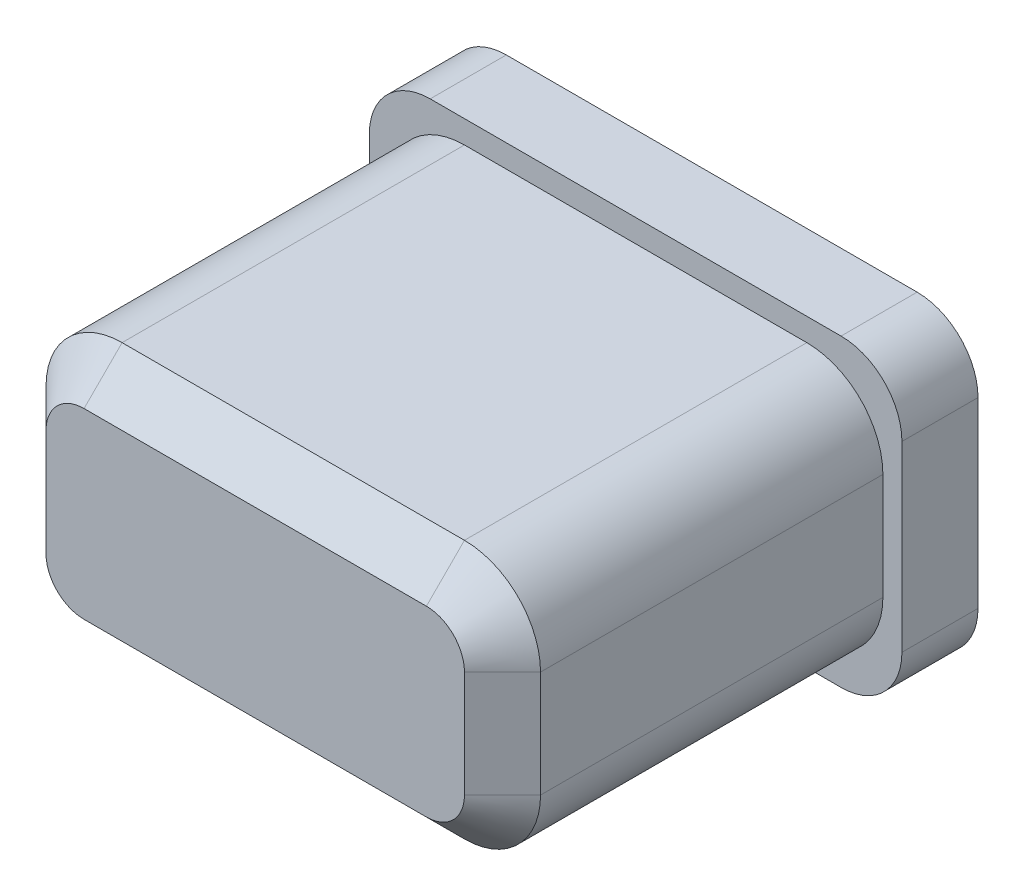
ISO-10303-21;
HEADER;
FILE_DESCRIPTION(('STEP AP214'),'2;1');
FILE_NAME('part.step','',(''),(''),'','','');
FILE_SCHEMA(('AUTOMOTIVE_DESIGN { 1 0 10303 214 1 1 1 1 }'));
ENDSEC;
DATA;
#1=APPLICATION_CONTEXT('core data for automotive mechanical design processes');
#2=APPLICATION_PROTOCOL_DEFINITION('international standard','automotive_design',2000,#1);
#3=PRODUCT_CONTEXT('',#1,'mechanical');
#4=PRODUCT('Part','Part','',(#3));
#5=PRODUCT_RELATED_PRODUCT_CATEGORY('part','',(#4));
#6=PRODUCT_DEFINITION_FORMATION('','',#4);
#7=PRODUCT_DEFINITION_CONTEXT('part definition',#1,'design');
#8=PRODUCT_DEFINITION('design','',#6,#7);
#9=PRODUCT_DEFINITION_SHAPE('','',#8);
#10=(LENGTH_UNIT() NAMED_UNIT(*) SI_UNIT(.MILLI.,.METRE.));
#11=(NAMED_UNIT(*) PLANE_ANGLE_UNIT() SI_UNIT($,.RADIAN.));
#12=(NAMED_UNIT(*) SI_UNIT($,.STERADIAN.) SOLID_ANGLE_UNIT());
#13=UNCERTAINTY_MEASURE_WITH_UNIT(LENGTH_MEASURE(1.E-05),#10,'distance_accuracy_value','');
#14=(GEOMETRIC_REPRESENTATION_CONTEXT(3) GLOBAL_UNCERTAINTY_ASSIGNED_CONTEXT((#13)) GLOBAL_UNIT_ASSIGNED_CONTEXT((#10,
#11,#12)) REPRESENTATION_CONTEXT('',''));
#15=CARTESIAN_POINT('',(0.,0.,0.));
#16=DIRECTION('',(0.,0.,1.));
#17=DIRECTION('',(1.,0.,0.));
#18=AXIS2_PLACEMENT_3D('',#15,#16,#17);
#19=CARTESIAN_POINT('',(3.25,1.7,5.));
#20=DIRECTION('',(-1.,0.,0.));
#21=DIRECTION('',(0.,0.,1.));
#22=AXIS2_PLACEMENT_3D('',#19,#20,#21);
#23=PLANE('',#22);
#24=DIRECTION('',(0.,0.,-1.));
#25=VECTOR('',#24,1.);
#26=CARTESIAN_POINT('',(3.25,0.7,5.));
#27=LINE('',#26,#25);
#28=CARTESIAN_POINT('',(3.25,0.7,0.));
#29=VERTEX_POINT('',#28);
#30=CARTESIAN_POINT('',(3.25,0.7,4.5));
#31=VERTEX_POINT('',#30);
#32=EDGE_CURVE('E232',#29,#31,#27,.F.);
#33=ORIENTED_EDGE('',*,*,#32,.T.);
#34=DIRECTION('',(0.,-1.,0.));
#35=VECTOR('',#34,1.);
#36=CARTESIAN_POINT('',(3.25,-0.7,4.5));
#37=LINE('',#36,#35);
#38=CARTESIAN_POINT('',(3.25,-0.7,4.5));
#39=VERTEX_POINT('',#38);
#40=EDGE_CURVE('E272',#31,#39,#37,.T.);
#41=ORIENTED_EDGE('',*,*,#40,.T.);
#42=DIRECTION('',(0.,0.,-1.));
#43=VECTOR('',#42,1.);
#44=CARTESIAN_POINT('',(3.25,-0.7,5.));
#45=LINE('',#44,#43);
#46=CARTESIAN_POINT('',(3.25,-0.7,0.));
#47=VERTEX_POINT('',#46);
#48=EDGE_CURVE('E229',#39,#47,#45,.T.);
#49=ORIENTED_EDGE('',*,*,#48,.T.);
#50=DIRECTION('',(0.,1.,0.));
#51=VECTOR('',#50,1.);
#52=CARTESIAN_POINT('',(3.25,1.7,0.));
#53=LINE('',#52,#51);
#54=EDGE_CURVE('E324',#47,#29,#53,.T.);
#55=ORIENTED_EDGE('',*,*,#54,.T.);
#56=EDGE_LOOP('',(#33,#41,#49,#55));
#57=FACE_BOUND('',#56,.T.);
#58=ADVANCED_FACE('F41',(#57),#23,.F.);
#59=CARTESIAN_POINT('',(-3.25,1.7,5.));
#60=DIRECTION('',(0.,-1.,0.));
#61=DIRECTION('',(0.,0.,-1.));
#62=AXIS2_PLACEMENT_3D('',#59,#60,#61);
#63=PLANE('',#62);
#64=DIRECTION('',(0.,0.,-1.));
#65=VECTOR('',#64,1.);
#66=CARTESIAN_POINT('',(-2.25,1.7,5.));
#67=LINE('',#66,#65);
#68=CARTESIAN_POINT('',(-2.25,1.7,0.));
#69=VERTEX_POINT('',#68);
#70=CARTESIAN_POINT('',(-2.25,1.7,4.5));
#71=VERTEX_POINT('',#70);
#72=EDGE_CURVE('E225',#69,#71,#67,.F.);
#73=ORIENTED_EDGE('',*,*,#72,.T.);
#74=DIRECTION('',(1.,0.,0.));
#75=VECTOR('',#74,1.);
#76=CARTESIAN_POINT('',(2.25,1.7,4.5));
#77=LINE('',#76,#75);
#78=CARTESIAN_POINT('',(2.25,1.7,4.5));
#79=VERTEX_POINT('',#78);
#80=EDGE_CURVE('E289',#71,#79,#77,.T.);
#81=ORIENTED_EDGE('',*,*,#80,.T.);
#82=DIRECTION('',(0.,0.,-1.));
#83=VECTOR('',#82,1.);
#84=CARTESIAN_POINT('',(2.25,1.7,5.));
#85=LINE('',#84,#83);
#86=CARTESIAN_POINT('',(2.25,1.7,0.));
#87=VERTEX_POINT('',#86);
#88=EDGE_CURVE('E222',#79,#87,#85,.T.);
#89=ORIENTED_EDGE('',*,*,#88,.T.);
#90=DIRECTION('',(-1.,0.,0.));
#91=VECTOR('',#90,1.);
#92=CARTESIAN_POINT('',(-3.25,1.7,0.));
#93=LINE('',#92,#91);
#94=EDGE_CURVE('E203',#87,#69,#93,.T.);
#95=ORIENTED_EDGE('',*,*,#94,.T.);
#96=EDGE_LOOP('',(#73,#81,#89,#95));
#97=FACE_BOUND('',#96,.T.);
#98=ADVANCED_FACE('F460',(#97),#63,.F.);
#99=CARTESIAN_POINT('',(-3.25,1.7,5.));
#100=DIRECTION('',(1.,0.,0.));
#101=DIRECTION('',(0.,1.,0.));
#102=AXIS2_PLACEMENT_3D('',#99,#100,#101);
#103=PLANE('',#102);
#104=DIRECTION('',(0.,0.,-1.));
#105=VECTOR('',#104,1.);
#106=CARTESIAN_POINT('',(-3.25,-0.7,5.));
#107=LINE('',#106,#105);
#108=CARTESIAN_POINT('',(-3.25,-0.7,0.));
#109=VERTEX_POINT('',#108);
#110=CARTESIAN_POINT('',(-3.25,-0.7,4.5));
#111=VERTEX_POINT('',#110);
#112=EDGE_CURVE('E180',#109,#111,#107,.F.);
#113=ORIENTED_EDGE('',*,*,#112,.T.);
#114=DIRECTION('',(0.,1.,0.));
#115=VECTOR('',#114,1.);
#116=CARTESIAN_POINT('',(-3.25,0.7,4.5));
#117=LINE('',#116,#115);
#118=CARTESIAN_POINT('',(-3.25,0.7,4.5));
#119=VERTEX_POINT('',#118);
#120=EDGE_CURVE('E283',#111,#119,#117,.T.);
#121=ORIENTED_EDGE('',*,*,#120,.T.);
#122=DIRECTION('',(0.,0.,-1.));
#123=VECTOR('',#122,1.);
#124=CARTESIAN_POINT('',(-3.25,0.7,5.));
#125=LINE('',#124,#123);
#126=CARTESIAN_POINT('',(-3.25,0.7,0.));
#127=VERTEX_POINT('',#126);
#128=EDGE_CURVE('E192',#119,#127,#125,.T.);
#129=ORIENTED_EDGE('',*,*,#128,.T.);
#130=DIRECTION('',(0.,-1.,0.));
#131=VECTOR('',#130,1.);
#132=CARTESIAN_POINT('',(-3.25,1.7,0.));
#133=LINE('',#132,#131);
#134=EDGE_CURVE('E196',#127,#109,#133,.T.);
#135=ORIENTED_EDGE('',*,*,#134,.T.);
#136=EDGE_LOOP('',(#113,#121,#129,#135));
#137=FACE_BOUND('',#136,.T.);
#138=ADVANCED_FACE('F197',(#137),#103,.F.);
#139=CARTESIAN_POINT('',(-3.25,-1.7,5.));
#140=DIRECTION('',(0.,1.,0.));
#141=DIRECTION('',(0.,0.,1.));
#142=AXIS2_PLACEMENT_3D('',#139,#140,#141);
#143=PLANE('',#142);
#144=DIRECTION('',(0.,0.,-1.));
#145=VECTOR('',#144,1.);
#146=CARTESIAN_POINT('',(2.25,-1.7,5.));
#147=LINE('',#146,#145);
#148=CARTESIAN_POINT('',(2.25,-1.7,0.));
#149=VERTEX_POINT('',#148);
#150=CARTESIAN_POINT('',(2.25,-1.7,4.5));
#151=VERTEX_POINT('',#150);
#152=EDGE_CURVE('E239',#149,#151,#147,.F.);
#153=ORIENTED_EDGE('',*,*,#152,.T.);
#154=DIRECTION('',(-1.,0.,0.));
#155=VECTOR('',#154,1.);
#156=CARTESIAN_POINT('',(-2.25,-1.7,4.5));
#157=LINE('',#156,#155);
#158=CARTESIAN_POINT('',(-2.25,-1.7,4.5));
#159=VERTEX_POINT('',#158);
#160=EDGE_CURVE('E278',#151,#159,#157,.T.);
#161=ORIENTED_EDGE('',*,*,#160,.T.);
#162=DIRECTION('',(0.,0.,-1.));
#163=VECTOR('',#162,1.);
#164=CARTESIAN_POINT('',(-2.25,-1.7,5.));
#165=LINE('',#164,#163);
#166=CARTESIAN_POINT('',(-2.25,-1.7,0.));
#167=VERTEX_POINT('',#166);
#168=EDGE_CURVE('E236',#159,#167,#165,.T.);
#169=ORIENTED_EDGE('',*,*,#168,.T.);
#170=DIRECTION('',(1.,0.,0.));
#171=VECTOR('',#170,1.);
#172=CARTESIAN_POINT('',(-3.25,-1.7,0.));
#173=LINE('',#172,#171);
#174=EDGE_CURVE('E193',#167,#149,#173,.T.);
#175=ORIENTED_EDGE('',*,*,#174,.T.);
#176=EDGE_LOOP('',(#153,#161,#169,#175));
#177=FACE_BOUND('',#176,.T.);
#178=ADVANCED_FACE('F405',(#177),#143,.F.);
#179=CARTESIAN_POINT('',(0.,0.,5.));
#180=DIRECTION('',(0.,0.,1.));
#181=DIRECTION('',(1.,0.,0.));
#182=AXIS2_PLACEMENT_3D('',#179,#180,#181);
#183=PLANE('',#182);
#184=DIRECTION('',(0.,1.,0.));
#185=VECTOR('',#184,1.);
#186=CARTESIAN_POINT('',(2.75,0.7,5.));
#187=LINE('',#186,#185);
#188=CARTESIAN_POINT('',(2.75,-0.7,5.));
#189=VERTEX_POINT('',#188);
#190=CARTESIAN_POINT('',(2.75,0.7,5.));
#191=VERTEX_POINT('',#190);
#192=EDGE_CURVE('E261',#189,#191,#187,.T.);
#193=ORIENTED_EDGE('',*,*,#192,.T.);
#194=CARTESIAN_POINT('',(2.25,0.7,5.));
#195=DIRECTION('',(0.,0.,1.));
#196=DIRECTION('',(1.,0.,0.));
#197=AXIS2_PLACEMENT_3D('',#194,#195,#196);
#198=CIRCLE('',#197,0.5);
#199=CARTESIAN_POINT('',(2.25,1.2,5.));
#200=VERTEX_POINT('',#199);
#201=EDGE_CURVE('E264',#191,#200,#198,.T.);
#202=ORIENTED_EDGE('',*,*,#201,.T.);
#203=DIRECTION('',(-1.,0.,0.));
#204=VECTOR('',#203,1.);
#205=CARTESIAN_POINT('',(-2.25,1.2,5.));
#206=LINE('',#205,#204);
#207=CARTESIAN_POINT('',(-2.25,1.2,5.));
#208=VERTEX_POINT('',#207);
#209=EDGE_CURVE('E243',#200,#208,#206,.T.);
#210=ORIENTED_EDGE('',*,*,#209,.T.);
#211=CARTESIAN_POINT('',(-2.25,0.7,5.));
#212=DIRECTION('',(0.,0.,1.));
#213=DIRECTION('',(1.,0.,0.));
#214=AXIS2_PLACEMENT_3D('',#211,#212,#213);
#215=CIRCLE('',#214,0.5);
#216=CARTESIAN_POINT('',(-2.75,0.7,5.));
#217=VERTEX_POINT('',#216);
#218=EDGE_CURVE('E246',#208,#217,#215,.T.);
#219=ORIENTED_EDGE('',*,*,#218,.T.);
#220=DIRECTION('',(0.,-1.,0.));
#221=VECTOR('',#220,1.);
#222=CARTESIAN_POINT('',(-2.75,-0.7,5.));
#223=LINE('',#222,#221);
#224=CARTESIAN_POINT('',(-2.75,-0.7,5.));
#225=VERTEX_POINT('',#224);
#226=EDGE_CURVE('E249',#217,#225,#223,.T.);
#227=ORIENTED_EDGE('',*,*,#226,.T.);
#228=CARTESIAN_POINT('',(-2.25,-0.7,5.));
#229=DIRECTION('',(0.,0.,1.));
#230=DIRECTION('',(1.,0.,0.));
#231=AXIS2_PLACEMENT_3D('',#228,#229,#230);
#232=CIRCLE('',#231,0.5);
#233=CARTESIAN_POINT('',(-2.25,-1.2,5.));
#234=VERTEX_POINT('',#233);
#235=EDGE_CURVE('E252',#225,#234,#232,.T.);
#236=ORIENTED_EDGE('',*,*,#235,.T.);
#237=DIRECTION('',(1.,0.,0.));
#238=VECTOR('',#237,1.);
#239=CARTESIAN_POINT('',(2.25,-1.2,5.));
#240=LINE('',#239,#238);
#241=CARTESIAN_POINT('',(2.25,-1.2,5.));
#242=VERTEX_POINT('',#241);
#243=EDGE_CURVE('E255',#234,#242,#240,.T.);
#244=ORIENTED_EDGE('',*,*,#243,.T.);
#245=CARTESIAN_POINT('',(2.25,-0.7,5.));
#246=DIRECTION('',(0.,0.,1.));
#247=DIRECTION('',(1.,0.,0.));
#248=AXIS2_PLACEMENT_3D('',#245,#246,#247);
#249=CIRCLE('',#248,0.5);
#250=EDGE_CURVE('E258',#242,#189,#249,.T.);
#251=ORIENTED_EDGE('',*,*,#250,.T.);
#252=EDGE_LOOP('',(#193,#202,#210,#219,#227,#236,#244,#251));
#253=FACE_BOUND('',#252,.T.);
#254=ADVANCED_FACE('F434',(#253),#183,.T.);
#255=CARTESIAN_POINT('',(-2.25,0.7,5.));
#256=DIRECTION('',(0.,0.,-1.));
#257=DIRECTION('',(-1.,0.,0.));
#258=AXIS2_PLACEMENT_3D('',#255,#256,#257);
#259=CYLINDRICAL_SURFACE('',#258,1.);
#260=ORIENTED_EDGE('',*,*,#128,.F.);
#261=CARTESIAN_POINT('',(-2.25,0.7,4.5));
#262=DIRECTION('',(0.,0.,1.));
#263=DIRECTION('',(1.,0.,0.));
#264=AXIS2_PLACEMENT_3D('',#261,#262,#263);
#265=CIRCLE('',#264,1.);
#266=EDGE_CURVE('E286',#119,#71,#265,.F.);
#267=ORIENTED_EDGE('',*,*,#266,.T.);
#268=ORIENTED_EDGE('',*,*,#72,.F.);
#269=CARTESIAN_POINT('',(-2.25,0.7,0.));
#270=DIRECTION('',(0.,0.,1.));
#271=DIRECTION('',(1.,0.,0.));
#272=AXIS2_PLACEMENT_3D('',#269,#270,#271);
#273=CIRCLE('',#272,1.);
#274=EDGE_CURVE('E219',#127,#69,#273,.F.);
#275=ORIENTED_EDGE('',*,*,#274,.F.);
#276=EDGE_LOOP('',(#260,#267,#268,#275));
#277=FACE_BOUND('',#276,.T.);
#278=ADVANCED_FACE('F457',(#277),#259,.T.);
#279=CARTESIAN_POINT('',(2.25,0.7,5.));
#280=DIRECTION('',(0.,0.,-1.));
#281=DIRECTION('',(-1.,0.,0.));
#282=AXIS2_PLACEMENT_3D('',#279,#280,#281);
#283=CYLINDRICAL_SURFACE('',#282,1.);
#284=ORIENTED_EDGE('',*,*,#88,.F.);
#285=CARTESIAN_POINT('',(2.25,0.7,4.5));
#286=DIRECTION('',(0.,0.,1.));
#287=DIRECTION('',(1.,0.,0.));
#288=AXIS2_PLACEMENT_3D('',#285,#286,#287);
#289=CIRCLE('',#288,1.);
#290=EDGE_CURVE('E268',#79,#31,#289,.F.);
#291=ORIENTED_EDGE('',*,*,#290,.T.);
#292=ORIENTED_EDGE('',*,*,#32,.F.);
#293=CARTESIAN_POINT('',(2.25,0.7,0.));
#294=DIRECTION('',(0.,0.,1.));
#295=DIRECTION('',(1.,0.,0.));
#296=AXIS2_PLACEMENT_3D('',#293,#294,#295);
#297=CIRCLE('',#296,1.);
#298=EDGE_CURVE('E212',#87,#29,#297,.F.);
#299=ORIENTED_EDGE('',*,*,#298,.F.);
#300=EDGE_LOOP('',(#284,#291,#292,#299));
#301=FACE_BOUND('',#300,.T.);
#302=ADVANCED_FACE('F419',(#301),#283,.T.);
#303=CARTESIAN_POINT('',(2.25,-0.7,5.));
#304=DIRECTION('',(0.,0.,-1.));
#305=DIRECTION('',(-1.,0.,0.));
#306=AXIS2_PLACEMENT_3D('',#303,#304,#305);
#307=CYLINDRICAL_SURFACE('',#306,1.);
#308=ORIENTED_EDGE('',*,*,#48,.F.);
#309=CARTESIAN_POINT('',(2.25,-0.7,4.5));
#310=DIRECTION('',(0.,0.,1.));
#311=DIRECTION('',(1.,0.,0.));
#312=AXIS2_PLACEMENT_3D('',#309,#310,#311);
#313=CIRCLE('',#312,1.);
#314=EDGE_CURVE('E275',#39,#151,#313,.F.);
#315=ORIENTED_EDGE('',*,*,#314,.T.);
#316=ORIENTED_EDGE('',*,*,#152,.F.);
#317=CARTESIAN_POINT('',(2.25,-0.7,0.));
#318=DIRECTION('',(0.,0.,1.));
#319=DIRECTION('',(1.,0.,0.));
#320=AXIS2_PLACEMENT_3D('',#317,#318,#319);
#321=CIRCLE('',#320,1.);
#322=EDGE_CURVE('E208',#47,#149,#321,.F.);
#323=ORIENTED_EDGE('',*,*,#322,.F.);
#324=EDGE_LOOP('',(#308,#315,#316,#323));
#325=FACE_BOUND('',#324,.T.);
#326=ADVANCED_FACE('F410',(#325),#307,.T.);
#327=CARTESIAN_POINT('',(-2.25,-0.7,5.));
#328=DIRECTION('',(0.,0.,-1.));
#329=DIRECTION('',(-1.,0.,0.));
#330=AXIS2_PLACEMENT_3D('',#327,#328,#329);
#331=CYLINDRICAL_SURFACE('',#330,1.);
#332=ORIENTED_EDGE('',*,*,#168,.F.);
#333=CARTESIAN_POINT('',(-2.25,-0.7,4.5));
#334=DIRECTION('',(0.,0.,1.));
#335=DIRECTION('',(1.,0.,0.));
#336=AXIS2_PLACEMENT_3D('',#333,#334,#335);
#337=CIRCLE('',#336,1.);
#338=EDGE_CURVE('E188',#159,#111,#337,.F.);
#339=ORIENTED_EDGE('',*,*,#338,.T.);
#340=ORIENTED_EDGE('',*,*,#112,.F.);
#341=CARTESIAN_POINT('',(-2.25,-0.7,0.));
#342=DIRECTION('',(0.,0.,1.));
#343=DIRECTION('',(1.,0.,0.));
#344=AXIS2_PLACEMENT_3D('',#341,#342,#343);
#345=CIRCLE('',#344,1.);
#346=EDGE_CURVE('E185',#167,#109,#345,.F.);
#347=ORIENTED_EDGE('',*,*,#346,.F.);
#348=EDGE_LOOP('',(#332,#339,#340,#347));
#349=FACE_BOUND('',#348,.T.);
#350=ADVANCED_FACE('F183',(#349),#331,.T.);
#351=CARTESIAN_POINT('',(-2.25,-0.7,5.));
#352=DIRECTION('',(0.,0.,-1.));
#353=DIRECTION('',(-1.,0.,0.));
#354=AXIS2_PLACEMENT_3D('',#351,#352,#353);
#355=CONICAL_SURFACE('',#354,0.5,0.785398163397447);
#356=DIRECTION('',(0.707106781186546,0.,0.707106781186549));
#357=VECTOR('',#356,1.);
#358=CARTESIAN_POINT('',(-3.25,-0.7,4.5));
#359=LINE('',#358,#357);
#360=EDGE_CURVE('E316',#111,#225,#359,.T.);
#361=ORIENTED_EDGE('',*,*,#360,.F.);
#362=ORIENTED_EDGE('',*,*,#338,.F.);
#363=DIRECTION('',(0.,-0.707106781186546,-0.707106781186549));
#364=VECTOR('',#363,1.);
#365=CARTESIAN_POINT('',(-2.25,-1.2,5.));
#366=LINE('',#365,#364);
#367=EDGE_CURVE('E320',#234,#159,#366,.T.);
#368=ORIENTED_EDGE('',*,*,#367,.F.);
#369=ORIENTED_EDGE('',*,*,#235,.F.);
#370=EDGE_LOOP('',(#361,#362,#368,#369));
#371=FACE_BOUND('',#370,.T.);
#372=ADVANCED_FACE('F448',(#371),#355,.T.);
#373=CARTESIAN_POINT('',(0.,-1.2,5.));
#374=DIRECTION('',(0.,-0.707106781186549,0.707106781186546));
#375=DIRECTION('',(-1.,0.,0.));
#376=AXIS2_PLACEMENT_3D('',#373,#374,#375);
#377=PLANE('',#376);
#378=ORIENTED_EDGE('',*,*,#367,.T.);
#379=ORIENTED_EDGE('',*,*,#160,.F.);
#380=DIRECTION('',(0.,-0.707106781186546,-0.707106781186549));
#381=VECTOR('',#380,1.);
#382=CARTESIAN_POINT('',(2.25,-1.2,5.));
#383=LINE('',#382,#381);
#384=EDGE_CURVE('E312',#242,#151,#383,.T.);
#385=ORIENTED_EDGE('',*,*,#384,.F.);
#386=ORIENTED_EDGE('',*,*,#243,.F.);
#387=EDGE_LOOP('',(#378,#379,#385,#386));
#388=FACE_BOUND('',#387,.T.);
#389=ADVANCED_FACE('F445',(#388),#377,.T.);
#390=CARTESIAN_POINT('',(-2.75,0.,5.));
#391=DIRECTION('',(-0.707106781186549,0.,0.707106781186546));
#392=DIRECTION('',(0.,1.,0.));
#393=AXIS2_PLACEMENT_3D('',#390,#391,#392);
#394=PLANE('',#393);
#395=ORIENTED_EDGE('',*,*,#360,.T.);
#396=ORIENTED_EDGE('',*,*,#226,.F.);
#397=DIRECTION('',(0.707106781186547,0.,0.707106781186548));
#398=VECTOR('',#397,1.);
#399=CARTESIAN_POINT('',(-3.25,0.7,4.5));
#400=LINE('',#399,#398);
#401=EDGE_CURVE('E308',#119,#217,#400,.T.);
#402=ORIENTED_EDGE('',*,*,#401,.F.);
#403=ORIENTED_EDGE('',*,*,#120,.F.);
#404=EDGE_LOOP('',(#395,#396,#402,#403));
#405=FACE_BOUND('',#404,.T.);
#406=ADVANCED_FACE('F454',(#405),#394,.T.);
#407=CARTESIAN_POINT('',(2.25,-0.7,5.));
#408=DIRECTION('',(0.,0.,-1.));
#409=DIRECTION('',(-1.,0.,0.));
#410=AXIS2_PLACEMENT_3D('',#407,#408,#409);
#411=CONICAL_SURFACE('',#410,0.5,0.785398163397447);
#412=ORIENTED_EDGE('',*,*,#384,.T.);
#413=ORIENTED_EDGE('',*,*,#314,.F.);
#414=DIRECTION('',(0.707106781186546,0.,-0.707106781186549));
#415=VECTOR('',#414,1.);
#416=CARTESIAN_POINT('',(2.75,-0.7,5.));
#417=LINE('',#416,#415);
#418=EDGE_CURVE('E304',#189,#39,#417,.T.);
#419=ORIENTED_EDGE('',*,*,#418,.F.);
#420=ORIENTED_EDGE('',*,*,#250,.F.);
#421=EDGE_LOOP('',(#412,#413,#419,#420));
#422=FACE_BOUND('',#421,.T.);
#423=ADVANCED_FACE('F441',(#422),#411,.T.);
#424=CARTESIAN_POINT('',(-2.25,0.7,5.));
#425=DIRECTION('',(0.,0.,-1.));
#426=DIRECTION('',(-1.,0.,0.));
#427=AXIS2_PLACEMENT_3D('',#424,#425,#426);
#428=CONICAL_SURFACE('',#427,0.5,0.785398163397447);
#429=ORIENTED_EDGE('',*,*,#401,.T.);
#430=ORIENTED_EDGE('',*,*,#218,.F.);
#431=DIRECTION('',(0.,-0.707106781186546,0.707106781186549));
#432=VECTOR('',#431,1.);
#433=CARTESIAN_POINT('',(-2.25,1.7,4.5));
#434=LINE('',#433,#432);
#435=EDGE_CURVE('E300',#71,#208,#434,.T.);
#436=ORIENTED_EDGE('',*,*,#435,.F.);
#437=ORIENTED_EDGE('',*,*,#266,.F.);
#438=EDGE_LOOP('',(#429,#430,#436,#437));
#439=FACE_BOUND('',#438,.T.);
#440=ADVANCED_FACE('F462',(#439),#428,.T.);
#441=CARTESIAN_POINT('',(2.75,0.,5.));
#442=DIRECTION('',(0.707106781186549,0.,0.707106781186546));
#443=DIRECTION('',(0.,-1.,0.));
#444=AXIS2_PLACEMENT_3D('',#441,#442,#443);
#445=PLANE('',#444);
#446=ORIENTED_EDGE('',*,*,#418,.T.);
#447=ORIENTED_EDGE('',*,*,#40,.F.);
#448=DIRECTION('',(0.707106781186546,0.,-0.707106781186549));
#449=VECTOR('',#448,1.);
#450=CARTESIAN_POINT('',(2.75,0.7,5.));
#451=LINE('',#450,#449);
#452=EDGE_CURVE('E296',#191,#31,#451,.T.);
#453=ORIENTED_EDGE('',*,*,#452,.F.);
#454=ORIENTED_EDGE('',*,*,#192,.F.);
#455=EDGE_LOOP('',(#446,#447,#453,#454));
#456=FACE_BOUND('',#455,.T.);
#457=ADVANCED_FACE('F439',(#456),#445,.T.);
#458=CARTESIAN_POINT('',(0.,1.2,5.));
#459=DIRECTION('',(0.,0.707106781186549,0.707106781186546));
#460=DIRECTION('',(1.,0.,0.));
#461=AXIS2_PLACEMENT_3D('',#458,#459,#460);
#462=PLANE('',#461);
#463=ORIENTED_EDGE('',*,*,#435,.T.);
#464=ORIENTED_EDGE('',*,*,#209,.F.);
#465=DIRECTION('',(0.,-0.707106781186546,0.707106781186549));
#466=VECTOR('',#465,1.);
#467=CARTESIAN_POINT('',(2.25,1.7,4.5));
#468=LINE('',#467,#466);
#469=EDGE_CURVE('E293',#79,#200,#468,.T.);
#470=ORIENTED_EDGE('',*,*,#469,.F.);
#471=ORIENTED_EDGE('',*,*,#80,.F.);
#472=EDGE_LOOP('',(#463,#464,#470,#471));
#473=FACE_BOUND('',#472,.T.);
#474=ADVANCED_FACE('F430',(#473),#462,.T.);
#475=CARTESIAN_POINT('',(2.25,0.7,5.));
#476=DIRECTION('',(0.,0.,-1.));
#477=DIRECTION('',(-1.,0.,0.));
#478=AXIS2_PLACEMENT_3D('',#475,#476,#477);
#479=CONICAL_SURFACE('',#478,0.5,0.785398163397447);
#480=ORIENTED_EDGE('',*,*,#452,.T.);
#481=ORIENTED_EDGE('',*,*,#290,.F.);
#482=ORIENTED_EDGE('',*,*,#469,.T.);
#483=ORIENTED_EDGE('',*,*,#201,.F.);
#484=EDGE_LOOP('',(#480,#481,#482,#483));
#485=FACE_BOUND('',#484,.T.);
#486=ADVANCED_FACE('F423',(#485),#479,.T.);
#487=CARTESIAN_POINT('',(0.,0.,0.));
#488=DIRECTION('',(0.,0.,1.));
#489=DIRECTION('',(1.,0.,0.));
#490=AXIS2_PLACEMENT_3D('',#487,#488,#489);
#491=PLANE('',#490);
#492=DIRECTION('',(0.,-1.,0.));
#493=VECTOR('',#492,1.);
#494=CARTESIAN_POINT('',(3.5,2.,0.));
#495=LINE('',#494,#493);
#496=CARTESIAN_POINT('',(3.5,1.2,0.));
#497=VERTEX_POINT('',#496);
#498=CARTESIAN_POINT('',(3.5,-1.2,0.));
#499=VERTEX_POINT('',#498);
#500=EDGE_CURVE('E385',#497,#499,#495,.T.);
#501=ORIENTED_EDGE('',*,*,#500,.F.);
#502=CARTESIAN_POINT('',(2.7,1.2,0.));
#503=DIRECTION('',(0.,0.,1.));
#504=DIRECTION('',(1.,0.,0.));
#505=AXIS2_PLACEMENT_3D('',#502,#503,#504);
#506=CIRCLE('',#505,0.8);
#507=CARTESIAN_POINT('',(2.7,2.,0.));
#508=VERTEX_POINT('',#507);
#509=EDGE_CURVE('E340',#497,#508,#506,.T.);
#510=ORIENTED_EDGE('',*,*,#509,.T.);
#511=DIRECTION('',(1.,0.,0.));
#512=VECTOR('',#511,1.);
#513=CARTESIAN_POINT('',(-3.5,2.,0.));
#514=LINE('',#513,#512);
#515=CARTESIAN_POINT('',(-2.7,2.,0.));
#516=VERTEX_POINT('',#515);
#517=EDGE_CURVE('E389',#516,#508,#514,.T.);
#518=ORIENTED_EDGE('',*,*,#517,.F.);
#519=CARTESIAN_POINT('',(-2.7,1.2,0.));
#520=DIRECTION('',(0.,0.,1.));
#521=DIRECTION('',(1.,0.,0.));
#522=AXIS2_PLACEMENT_3D('',#519,#520,#521);
#523=CIRCLE('',#522,0.8);
#524=CARTESIAN_POINT('',(-3.5,1.2,0.));
#525=VERTEX_POINT('',#524);
#526=EDGE_CURVE('E331',#516,#525,#523,.T.);
#527=ORIENTED_EDGE('',*,*,#526,.T.);
#528=DIRECTION('',(0.,1.,0.));
#529=VECTOR('',#528,1.);
#530=CARTESIAN_POINT('',(-3.5,2.,0.));
#531=LINE('',#530,#529);
#532=CARTESIAN_POINT('',(-3.5,-1.2,0.));
#533=VERTEX_POINT('',#532);
#534=EDGE_CURVE('E384',#533,#525,#531,.T.);
#535=ORIENTED_EDGE('',*,*,#534,.F.);
#536=CARTESIAN_POINT('',(-2.7,-1.2,0.));
#537=DIRECTION('',(0.,0.,1.));
#538=DIRECTION('',(1.,0.,0.));
#539=AXIS2_PLACEMENT_3D('',#536,#537,#538);
#540=CIRCLE('',#539,0.8);
#541=CARTESIAN_POINT('',(-2.7,-2.,0.));
#542=VERTEX_POINT('',#541);
#543=EDGE_CURVE('E334',#533,#542,#540,.T.);
#544=ORIENTED_EDGE('',*,*,#543,.T.);
#545=DIRECTION('',(-1.,0.,0.));
#546=VECTOR('',#545,1.);
#547=CARTESIAN_POINT('',(-3.5,-2.,0.));
#548=LINE('',#547,#546);
#549=CARTESIAN_POINT('',(2.7,-2.,0.));
#550=VERTEX_POINT('',#549);
#551=EDGE_CURVE('E374',#550,#542,#548,.T.);
#552=ORIENTED_EDGE('',*,*,#551,.F.);
#553=CARTESIAN_POINT('',(2.7,-1.2,0.));
#554=DIRECTION('',(0.,0.,1.));
#555=DIRECTION('',(1.,0.,0.));
#556=AXIS2_PLACEMENT_3D('',#553,#554,#555);
#557=CIRCLE('',#556,0.8);
#558=EDGE_CURVE('E337',#550,#499,#557,.T.);
#559=ORIENTED_EDGE('',*,*,#558,.T.);
#560=EDGE_LOOP('',(#501,#510,#518,#527,#535,#544,#552,#559));
#561=FACE_BOUND('',#560,.T.);
#562=ORIENTED_EDGE('',*,*,#134,.F.);
#563=ORIENTED_EDGE('',*,*,#274,.T.);
#564=ORIENTED_EDGE('',*,*,#94,.F.);
#565=ORIENTED_EDGE('',*,*,#298,.T.);
#566=ORIENTED_EDGE('',*,*,#54,.F.);
#567=ORIENTED_EDGE('',*,*,#322,.T.);
#568=ORIENTED_EDGE('',*,*,#174,.F.);
#569=ORIENTED_EDGE('',*,*,#346,.T.);
#570=EDGE_LOOP('',(#562,#563,#564,#565,#566,#567,#568,#569));
#571=FACE_BOUND('',#570,.T.);
#572=ADVANCED_FACE('F205',(#561,#571),#491,.T.);
#573=CARTESIAN_POINT('',(3.5,2.,-1.));
#574=DIRECTION('',(-1.,0.,0.));
#575=DIRECTION('',(0.,-1.,0.));
#576=AXIS2_PLACEMENT_3D('',#573,#574,#575);
#577=PLANE('',#576);
#578=DIRECTION('',(0.,-1.,0.));
#579=VECTOR('',#578,1.);
#580=CARTESIAN_POINT('',(3.5,2.,-1.));
#581=LINE('',#580,#579);
#582=CARTESIAN_POINT('',(3.5,1.2,-1.));
#583=VERTEX_POINT('',#582);
#584=CARTESIAN_POINT('',(3.5,-1.2,-1.));
#585=VERTEX_POINT('',#584);
#586=EDGE_CURVE('E397',#583,#585,#581,.T.);
#587=ORIENTED_EDGE('',*,*,#586,.F.);
#588=DIRECTION('',(0.,0.,1.));
#589=VECTOR('',#588,1.);
#590=CARTESIAN_POINT('',(3.5,1.2,-1.));
#591=LINE('',#590,#589);
#592=EDGE_CURVE('E327',#583,#497,#591,.T.);
#593=ORIENTED_EDGE('',*,*,#592,.T.);
#594=ORIENTED_EDGE('',*,*,#500,.T.);
#595=DIRECTION('',(0.,0.,1.));
#596=VECTOR('',#595,1.);
#597=CARTESIAN_POINT('',(3.5,-1.2,-1.));
#598=LINE('',#597,#596);
#599=EDGE_CURVE('E292',#499,#585,#598,.F.);
#600=ORIENTED_EDGE('',*,*,#599,.T.);
#601=EDGE_LOOP('',(#587,#593,#594,#600));
#602=FACE_BOUND('',#601,.T.);
#603=ADVANCED_FACE('F557',(#602),#577,.F.);
#604=CARTESIAN_POINT('',(-3.5,-2.,-1.));
#605=DIRECTION('',(0.,1.,0.));
#606=DIRECTION('',(-1.,0.,0.));
#607=AXIS2_PLACEMENT_3D('',#604,#605,#606);
#608=PLANE('',#607);
#609=DIRECTION('',(-1.,0.,0.));
#610=VECTOR('',#609,1.);
#611=CARTESIAN_POINT('',(-3.5,-2.,-1.));
#612=LINE('',#611,#610);
#613=CARTESIAN_POINT('',(2.7,-2.,-1.));
#614=VERTEX_POINT('',#613);
#615=CARTESIAN_POINT('',(-2.7,-2.,-1.));
#616=VERTEX_POINT('',#615);
#617=EDGE_CURVE('E376',#614,#616,#612,.T.);
#618=ORIENTED_EDGE('',*,*,#617,.F.);
#619=DIRECTION('',(0.,0.,1.));
#620=VECTOR('',#619,1.);
#621=CARTESIAN_POINT('',(2.7,-2.,-1.));
#622=LINE('',#621,#620);
#623=EDGE_CURVE('E364',#614,#550,#622,.T.);
#624=ORIENTED_EDGE('',*,*,#623,.T.);
#625=ORIENTED_EDGE('',*,*,#551,.T.);
#626=DIRECTION('',(0.,0.,1.));
#627=VECTOR('',#626,1.);
#628=CARTESIAN_POINT('',(-2.7,-2.,-1.));
#629=LINE('',#628,#627);
#630=EDGE_CURVE('E361',#542,#616,#629,.F.);
#631=ORIENTED_EDGE('',*,*,#630,.T.);
#632=EDGE_LOOP('',(#618,#624,#625,#631));
#633=FACE_BOUND('',#632,.T.);
#634=ADVANCED_FACE('F373',(#633),#608,.F.);
#635=CARTESIAN_POINT('',(-3.5,2.,-1.));
#636=DIRECTION('',(1.,0.,0.));
#637=DIRECTION('',(0.,1.,0.));
#638=AXIS2_PLACEMENT_3D('',#635,#636,#637);
#639=PLANE('',#638);
#640=DIRECTION('',(0.,1.,0.));
#641=VECTOR('',#640,1.);
#642=CARTESIAN_POINT('',(-3.5,2.,-1.));
#643=LINE('',#642,#641);
#644=CARTESIAN_POINT('',(-3.5,-1.2,-1.));
#645=VERTEX_POINT('',#644);
#646=CARTESIAN_POINT('',(-3.5,1.2,-1.));
#647=VERTEX_POINT('',#646);
#648=EDGE_CURVE('E535',#645,#647,#643,.T.);
#649=ORIENTED_EDGE('',*,*,#648,.F.);
#650=DIRECTION('',(0.,0.,1.));
#651=VECTOR('',#650,1.);
#652=CARTESIAN_POINT('',(-3.5,-1.2,-1.));
#653=LINE('',#652,#651);
#654=EDGE_CURVE('E11',#645,#533,#653,.T.);
#655=ORIENTED_EDGE('',*,*,#654,.T.);
#656=ORIENTED_EDGE('',*,*,#534,.T.);
#657=DIRECTION('',(0.,0.,1.));
#658=VECTOR('',#657,1.);
#659=CARTESIAN_POINT('',(-3.5,1.2,-1.));
#660=LINE('',#659,#658);
#661=EDGE_CURVE('E50',#525,#647,#660,.F.);
#662=ORIENTED_EDGE('',*,*,#661,.T.);
#663=EDGE_LOOP('',(#649,#655,#656,#662));
#664=FACE_BOUND('',#663,.T.);
#665=ADVANCED_FACE('F534',(#664),#639,.F.);
#666=CARTESIAN_POINT('',(-3.5,2.,-1.));
#667=DIRECTION('',(0.,-1.,0.));
#668=DIRECTION('',(1.,0.,0.));
#669=AXIS2_PLACEMENT_3D('',#666,#667,#668);
#670=PLANE('',#669);
#671=ORIENTED_EDGE('',*,*,#517,.T.);
#672=DIRECTION('',(0.,0.,1.));
#673=VECTOR('',#672,1.);
#674=CARTESIAN_POINT('',(2.7,2.,-1.));
#675=LINE('',#674,#673);
#676=CARTESIAN_POINT('',(2.7,2.,-1.));
#677=VERTEX_POINT('',#676);
#678=EDGE_CURVE('E347',#508,#677,#675,.F.);
#679=ORIENTED_EDGE('',*,*,#678,.T.);
#680=DIRECTION('',(1.,0.,0.));
#681=VECTOR('',#680,1.);
#682=CARTESIAN_POINT('',(-3.5,2.,-1.));
#683=LINE('',#682,#681);
#684=CARTESIAN_POINT('',(-2.7,2.,-1.));
#685=VERTEX_POINT('',#684);
#686=EDGE_CURVE('E297',#685,#677,#683,.T.);
#687=ORIENTED_EDGE('',*,*,#686,.F.);
#688=DIRECTION('',(0.,0.,1.));
#689=VECTOR('',#688,1.);
#690=CARTESIAN_POINT('',(-2.7,2.,-1.));
#691=LINE('',#690,#689);
#692=EDGE_CURVE('E343',#685,#516,#691,.T.);
#693=ORIENTED_EDGE('',*,*,#692,.T.);
#694=EDGE_LOOP('',(#671,#679,#687,#693));
#695=FACE_BOUND('',#694,.T.);
#696=ADVANCED_FACE('F541',(#695),#670,.F.);
#697=CARTESIAN_POINT('',(0.,0.,-1.));
#698=DIRECTION('',(0.,0.,1.));
#699=DIRECTION('',(1.,0.,0.));
#700=AXIS2_PLACEMENT_3D('',#697,#698,#699);
#701=PLANE('',#700);
#702=ORIENTED_EDGE('',*,*,#686,.T.);
#703=CARTESIAN_POINT('',(2.7,1.2,-1.));
#704=DIRECTION('',(0.,0.,1.));
#705=DIRECTION('',(1.,0.,0.));
#706=AXIS2_PLACEMENT_3D('',#703,#704,#705);
#707=CIRCLE('',#706,0.8);
#708=EDGE_CURVE('E358',#677,#583,#707,.F.);
#709=ORIENTED_EDGE('',*,*,#708,.T.);
#710=ORIENTED_EDGE('',*,*,#586,.T.);
#711=CARTESIAN_POINT('',(2.7,-1.2,-1.));
#712=DIRECTION('',(0.,0.,1.));
#713=DIRECTION('',(1.,0.,0.));
#714=AXIS2_PLACEMENT_3D('',#711,#712,#713);
#715=CIRCLE('',#714,0.8);
#716=EDGE_CURVE('E355',#585,#614,#715,.F.);
#717=ORIENTED_EDGE('',*,*,#716,.T.);
#718=ORIENTED_EDGE('',*,*,#617,.T.);
#719=CARTESIAN_POINT('',(-2.7,-1.2,-1.));
#720=DIRECTION('',(0.,0.,1.));
#721=DIRECTION('',(1.,0.,0.));
#722=AXIS2_PLACEMENT_3D('',#719,#720,#721);
#723=CIRCLE('',#722,0.8);
#724=EDGE_CURVE('E63',#616,#645,#723,.F.);
#725=ORIENTED_EDGE('',*,*,#724,.T.);
#726=ORIENTED_EDGE('',*,*,#648,.T.);
#727=CARTESIAN_POINT('',(-2.7,1.2,-1.));
#728=DIRECTION('',(0.,0.,1.));
#729=DIRECTION('',(1.,0.,0.));
#730=AXIS2_PLACEMENT_3D('',#727,#728,#729);
#731=CIRCLE('',#730,0.8);
#732=EDGE_CURVE('E350',#647,#685,#731,.F.);
#733=ORIENTED_EDGE('',*,*,#732,.T.);
#734=EDGE_LOOP('',(#702,#709,#710,#717,#718,#725,#726,#733));
#735=FACE_BOUND('',#734,.T.);
#736=ADVANCED_FACE('F523',(#735),#701,.F.);
#737=CARTESIAN_POINT('',(2.7,1.2,-1.));
#738=DIRECTION('',(0.,0.,1.));
#739=DIRECTION('',(1.,0.,0.));
#740=AXIS2_PLACEMENT_3D('',#737,#738,#739);
#741=CYLINDRICAL_SURFACE('',#740,0.8);
#742=ORIENTED_EDGE('',*,*,#708,.F.);
#743=ORIENTED_EDGE('',*,*,#678,.F.);
#744=ORIENTED_EDGE('',*,*,#509,.F.);
#745=ORIENTED_EDGE('',*,*,#592,.F.);
#746=EDGE_LOOP('',(#742,#743,#744,#745));
#747=FACE_BOUND('',#746,.T.);
#748=ADVANCED_FACE('F519',(#747),#741,.T.);
#749=CARTESIAN_POINT('',(2.7,-1.2,-1.));
#750=DIRECTION('',(0.,0.,1.));
#751=DIRECTION('',(1.,0.,0.));
#752=AXIS2_PLACEMENT_3D('',#749,#750,#751);
#753=CYLINDRICAL_SURFACE('',#752,0.8);
#754=ORIENTED_EDGE('',*,*,#716,.F.);
#755=ORIENTED_EDGE('',*,*,#599,.F.);
#756=ORIENTED_EDGE('',*,*,#558,.F.);
#757=ORIENTED_EDGE('',*,*,#623,.F.);
#758=EDGE_LOOP('',(#754,#755,#756,#757));
#759=FACE_BOUND('',#758,.T.);
#760=ADVANCED_FACE('F522',(#759),#753,.T.);
#761=CARTESIAN_POINT('',(-2.7,-1.2,-1.));
#762=DIRECTION('',(0.,0.,1.));
#763=DIRECTION('',(1.,0.,0.));
#764=AXIS2_PLACEMENT_3D('',#761,#762,#763);
#765=CYLINDRICAL_SURFACE('',#764,0.8);
#766=ORIENTED_EDGE('',*,*,#724,.F.);
#767=ORIENTED_EDGE('',*,*,#630,.F.);
#768=ORIENTED_EDGE('',*,*,#543,.F.);
#769=ORIENTED_EDGE('',*,*,#654,.F.);
#770=EDGE_LOOP('',(#766,#767,#768,#769));
#771=FACE_BOUND('',#770,.T.);
#772=ADVANCED_FACE('F526',(#771),#765,.T.);
#773=CARTESIAN_POINT('',(-2.7,1.2,-1.));
#774=DIRECTION('',(0.,0.,1.));
#775=DIRECTION('',(1.,0.,0.));
#776=AXIS2_PLACEMENT_3D('',#773,#774,#775);
#777=CYLINDRICAL_SURFACE('',#776,0.8);
#778=ORIENTED_EDGE('',*,*,#732,.F.);
#779=ORIENTED_EDGE('',*,*,#661,.F.);
#780=ORIENTED_EDGE('',*,*,#526,.F.);
#781=ORIENTED_EDGE('',*,*,#692,.F.);
#782=EDGE_LOOP('',(#778,#779,#780,#781));
#783=FACE_BOUND('',#782,.T.);
#784=ADVANCED_FACE('F43',(#783),#777,.T.);
#785=CLOSED_SHELL('',(#58,#98,#138,#178,#254,#278,#302,#326,#350,#372,#389,#406,#423,#440,#457,
#474,#486,#572,#603,#634,#665,#696,#736,#748,#760,#772,#784));
#786=MANIFOLD_SOLID_BREP('B2',#785);
#787=ADVANCED_BREP_SHAPE_REPRESENTATION('',(#18,#786),#14);
#788=SHAPE_DEFINITION_REPRESENTATION(#9,#787);
ENDSEC;
END-ISO-10303-21;
